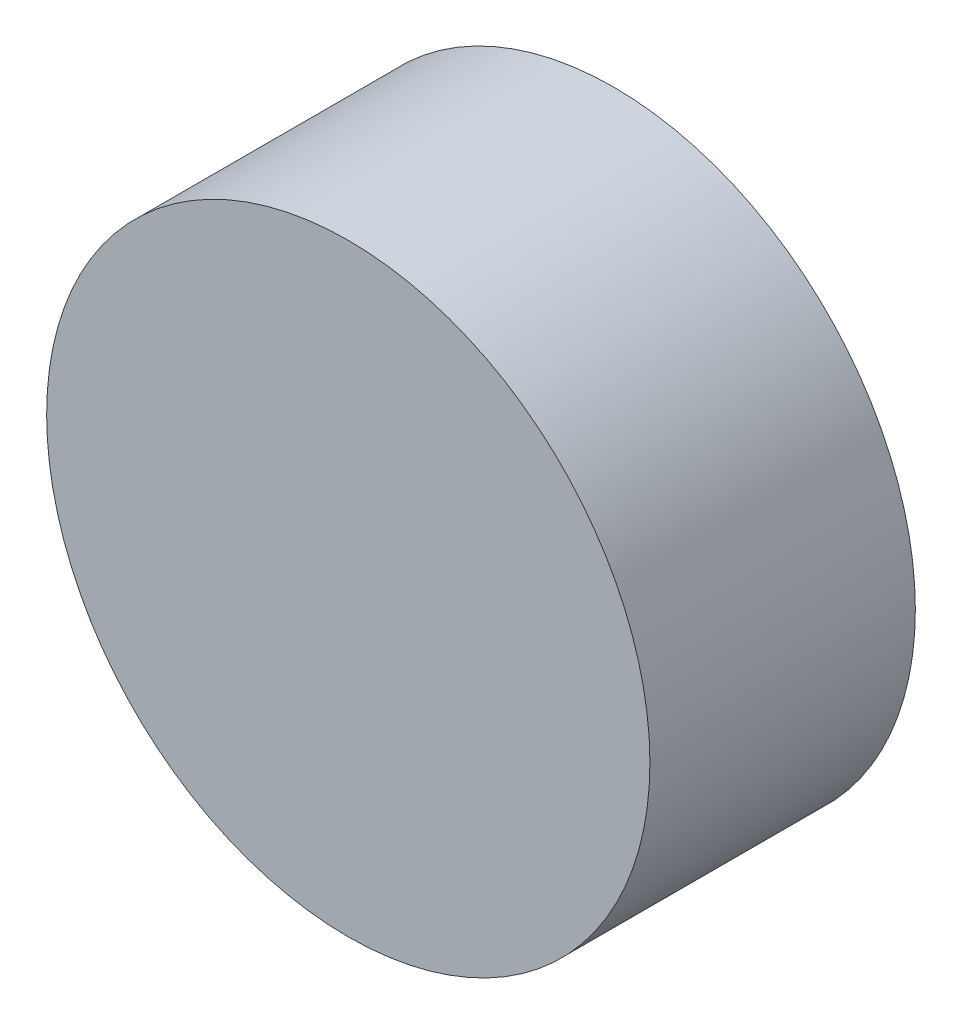
ISO-10303-21;
HEADER;
FILE_DESCRIPTION(('STEP AP214'),'2;1');
FILE_NAME('part.step','',(''),(''),'','','');
FILE_SCHEMA(('AUTOMOTIVE_DESIGN { 1 0 10303 214 1 1 1 1 }'));
ENDSEC;
DATA;
#1=APPLICATION_CONTEXT('core data for automotive mechanical design processes');
#2=APPLICATION_PROTOCOL_DEFINITION('international standard','automotive_design',2000,#1);
#3=PRODUCT_CONTEXT('',#1,'mechanical');
#4=PRODUCT('Part','Part','',(#3));
#5=PRODUCT_RELATED_PRODUCT_CATEGORY('part','',(#4));
#6=PRODUCT_DEFINITION_FORMATION('','',#4);
#7=PRODUCT_DEFINITION_CONTEXT('part definition',#1,'design');
#8=PRODUCT_DEFINITION('design','',#6,#7);
#9=PRODUCT_DEFINITION_SHAPE('','',#8);
#10=(LENGTH_UNIT() NAMED_UNIT(*) SI_UNIT(.MILLI.,.METRE.));
#11=(NAMED_UNIT(*) PLANE_ANGLE_UNIT() SI_UNIT($,.RADIAN.));
#12=(NAMED_UNIT(*) SI_UNIT($,.STERADIAN.) SOLID_ANGLE_UNIT());
#13=UNCERTAINTY_MEASURE_WITH_UNIT(LENGTH_MEASURE(1.E-05),#10,'distance_accuracy_value','');
#14=(GEOMETRIC_REPRESENTATION_CONTEXT(3) GLOBAL_UNCERTAINTY_ASSIGNED_CONTEXT((#13)) GLOBAL_UNIT_ASSIGNED_CONTEXT((#10,
#11,#12)) REPRESENTATION_CONTEXT('',''));
#15=CARTESIAN_POINT('',(0.,0.,0.));
#16=DIRECTION('',(0.,0.,1.));
#17=DIRECTION('',(1.,0.,0.));
#18=AXIS2_PLACEMENT_3D('',#15,#16,#17);
#19=CARTESIAN_POINT('',(0.,0.,11.));
#20=DIRECTION('',(0.,0.,-1.));
#21=DIRECTION('',(-1.,0.,0.));
#22=AXIS2_PLACEMENT_3D('',#19,#20,#21);
#23=CYLINDRICAL_SURFACE('',#22,12.5);
#24=CARTESIAN_POINT('',(0.,0.,11.));
#25=DIRECTION('',(0.,0.,1.));
#26=DIRECTION('',(1.,0.,0.));
#27=AXIS2_PLACEMENT_3D('',#24,#25,#26);
#28=CIRCLE('',#27,12.5);
#29=CARTESIAN_POINT('',(12.5,0.,11.));
#30=VERTEX_POINT('',#29);
#31=EDGE_CURVE('E10',#30,#30,#28,.T.);
#32=ORIENTED_EDGE('',*,*,#31,.F.);
#33=EDGE_LOOP('',(#32));
#34=FACE_BOUND('',#33,.T.);
#35=CARTESIAN_POINT('',(0.,0.,0.));
#36=DIRECTION('',(0.,0.,1.));
#37=DIRECTION('',(1.,0.,0.));
#38=AXIS2_PLACEMENT_3D('',#35,#36,#37);
#39=CIRCLE('',#38,12.5);
#40=CARTESIAN_POINT('',(12.5,0.,0.));
#41=VERTEX_POINT('',#40);
#42=EDGE_CURVE('E40',#41,#41,#39,.T.);
#43=ORIENTED_EDGE('',*,*,#42,.T.);
#44=EDGE_LOOP('',(#43));
#45=FACE_BOUND('',#44,.T.);
#46=ADVANCED_FACE('F37',(#34,#45),#23,.T.);
#47=CARTESIAN_POINT('',(0.,0.,11.));
#48=DIRECTION('',(0.,0.,1.));
#49=DIRECTION('',(1.,0.,0.));
#50=AXIS2_PLACEMENT_3D('',#47,#48,#49);
#51=PLANE('',#50);
#52=ORIENTED_EDGE('',*,*,#31,.T.);
#53=EDGE_LOOP('',(#52));
#54=FACE_BOUND('',#53,.T.);
#55=ADVANCED_FACE('F54',(#54),#51,.T.);
#56=CARTESIAN_POINT('',(0.,0.,0.));
#57=DIRECTION('',(0.,0.,1.));
#58=DIRECTION('',(1.,0.,0.));
#59=AXIS2_PLACEMENT_3D('',#56,#57,#58);
#60=PLANE('',#59);
#61=ORIENTED_EDGE('',*,*,#42,.F.);
#62=EDGE_LOOP('',(#61));
#63=FACE_BOUND('',#62,.T.);
#64=ADVANCED_FACE('F52',(#63),#60,.F.);
#65=CLOSED_SHELL('',(#46,#55,#64));
#66=MANIFOLD_SOLID_BREP('B2',#65);
#67=ADVANCED_BREP_SHAPE_REPRESENTATION('',(#18,#66),#14);
#68=SHAPE_DEFINITION_REPRESENTATION(#9,#67);
ENDSEC;
END-ISO-10303-21;
